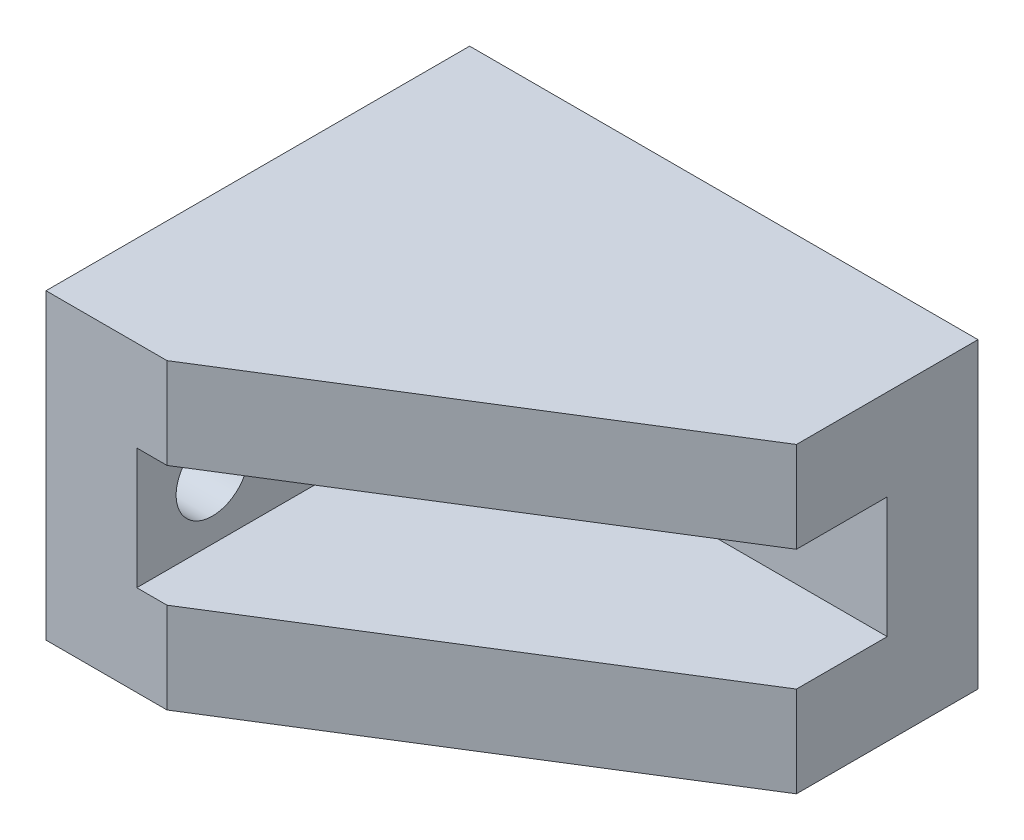
ISO-10303-21;
HEADER;
FILE_DESCRIPTION(('STEP AP214'),'2;1');
FILE_NAME('part.step','',(''),(''),'','','');
FILE_SCHEMA(('AUTOMOTIVE_DESIGN { 1 0 10303 214 1 1 1 1 }'));
ENDSEC;
DATA;
#1=APPLICATION_CONTEXT('core data for automotive mechanical design processes');
#2=APPLICATION_PROTOCOL_DEFINITION('international standard','automotive_design',2000,#1);
#3=PRODUCT_CONTEXT('',#1,'mechanical');
#4=PRODUCT('Part','Part','',(#3));
#5=PRODUCT_RELATED_PRODUCT_CATEGORY('part','',(#4));
#6=PRODUCT_DEFINITION_FORMATION('','',#4);
#7=PRODUCT_DEFINITION_CONTEXT('part definition',#1,'design');
#8=PRODUCT_DEFINITION('design','',#6,#7);
#9=PRODUCT_DEFINITION_SHAPE('','',#8);
#10=(LENGTH_UNIT() NAMED_UNIT(*) SI_UNIT(.MILLI.,.METRE.));
#11=(NAMED_UNIT(*) PLANE_ANGLE_UNIT() SI_UNIT($,.RADIAN.));
#12=(NAMED_UNIT(*) SI_UNIT($,.STERADIAN.) SOLID_ANGLE_UNIT());
#13=UNCERTAINTY_MEASURE_WITH_UNIT(LENGTH_MEASURE(1.E-05),#10,'distance_accuracy_value','');
#14=(GEOMETRIC_REPRESENTATION_CONTEXT(3) GLOBAL_UNCERTAINTY_ASSIGNED_CONTEXT((#13)) GLOBAL_UNIT_ASSIGNED_CONTEXT((#10,
#11,#12)) REPRESENTATION_CONTEXT('',''));
#15=CARTESIAN_POINT('',(0.,0.,0.));
#16=DIRECTION('',(0.,0.,1.));
#17=DIRECTION('',(1.,0.,0.));
#18=AXIS2_PLACEMENT_3D('',#15,#16,#17);
#19=CARTESIAN_POINT('',(0.,25.,35.));
#20=DIRECTION('',(0.,0.,-1.));
#21=DIRECTION('',(-1.,0.,0.));
#22=AXIS2_PLACEMENT_3D('',#19,#20,#21);
#23=PLANE('',#22);
#24=DIRECTION('',(1.,0.,0.));
#25=VECTOR('',#24,1.);
#26=CARTESIAN_POINT('',(0.,7.5,35.));
#27=LINE('',#26,#25);
#28=CARTESIAN_POINT('',(7.5,7.5,35.));
#29=VERTEX_POINT('',#28);
#30=CARTESIAN_POINT('',(10.,7.5,35.));
#31=VERTEX_POINT('',#30);
#32=EDGE_CURVE('E178',#29,#31,#27,.T.);
#33=ORIENTED_EDGE('',*,*,#32,.F.);
#34=DIRECTION('',(0.,-1.,0.));
#35=VECTOR('',#34,1.);
#36=CARTESIAN_POINT('',(7.5,25.,35.));
#37=LINE('',#36,#35);
#38=CARTESIAN_POINT('',(7.5,17.5,35.));
#39=VERTEX_POINT('',#38);
#40=EDGE_CURVE('E130',#39,#29,#37,.T.);
#41=ORIENTED_EDGE('',*,*,#40,.F.);
#42=DIRECTION('',(1.,0.,0.));
#43=VECTOR('',#42,1.);
#44=CARTESIAN_POINT('',(0.,17.5,35.));
#45=LINE('',#44,#43);
#46=CARTESIAN_POINT('',(10.,17.5,35.));
#47=VERTEX_POINT('',#46);
#48=EDGE_CURVE('E162',#39,#47,#45,.T.);
#49=ORIENTED_EDGE('',*,*,#48,.T.);
#50=DIRECTION('',(0.,-1.,0.));
#51=VECTOR('',#50,1.);
#52=CARTESIAN_POINT('',(10.,25.,35.));
#53=LINE('',#52,#51);
#54=CARTESIAN_POINT('',(10.,25.,35.));
#55=VERTEX_POINT('',#54);
#56=EDGE_CURVE('E42',#55,#47,#53,.T.);
#57=ORIENTED_EDGE('',*,*,#56,.F.);
#58=DIRECTION('',(1.,0.,0.));
#59=VECTOR('',#58,1.);
#60=CARTESIAN_POINT('',(0.,25.,35.));
#61=LINE('',#60,#59);
#62=CARTESIAN_POINT('',(0.,25.,35.));
#63=VERTEX_POINT('',#62);
#64=EDGE_CURVE('E90',#63,#55,#61,.T.);
#65=ORIENTED_EDGE('',*,*,#64,.F.);
#66=DIRECTION('',(0.,-1.,0.));
#67=VECTOR('',#66,1.);
#68=CARTESIAN_POINT('',(0.,25.,35.));
#69=LINE('',#68,#67);
#70=CARTESIAN_POINT('',(0.,0.,35.));
#71=VERTEX_POINT('',#70);
#72=EDGE_CURVE('E11',#63,#71,#69,.T.);
#73=ORIENTED_EDGE('',*,*,#72,.T.);
#74=DIRECTION('',(1.,0.,0.));
#75=VECTOR('',#74,1.);
#76=CARTESIAN_POINT('',(0.,0.,35.));
#77=LINE('',#76,#75);
#78=CARTESIAN_POINT('',(10.,0.,35.));
#79=VERTEX_POINT('',#78);
#80=EDGE_CURVE('E129',#71,#79,#77,.T.);
#81=ORIENTED_EDGE('',*,*,#80,.T.);
#82=EDGE_CURVE('E115',#31,#79,#53,.T.);
#83=ORIENTED_EDGE('',*,*,#82,.F.);
#84=EDGE_LOOP('',(#33,#41,#49,#57,#65,#73,#81,#83));
#85=FACE_BOUND('',#84,.T.);
#86=ADVANCED_FACE('F34',(#85),#23,.F.);
#87=CARTESIAN_POINT('',(10.,25.,35.));
#88=DIRECTION('',(-0.52999894000318,0.,-0.847998304005088));
#89=DIRECTION('',(-0.847998304005088,0.,0.52999894000318));
#90=AXIS2_PLACEMENT_3D('',#87,#88,#89);
#91=PLANE('',#90);
#92=DIRECTION('',(0.847998304005088,0.,-0.52999894000318));
#93=VECTOR('',#92,1.);
#94=CARTESIAN_POINT('',(10.,7.5,35.));
#95=LINE('',#94,#93);
#96=CARTESIAN_POINT('',(42.,7.5,15.));
#97=VERTEX_POINT('',#96);
#98=EDGE_CURVE('E151',#31,#97,#95,.T.);
#99=ORIENTED_EDGE('',*,*,#98,.F.);
#100=ORIENTED_EDGE('',*,*,#82,.T.);
#101=DIRECTION('',(0.847998304005088,0.,-0.52999894000318));
#102=VECTOR('',#101,1.);
#103=CARTESIAN_POINT('',(10.,0.,35.));
#104=LINE('',#103,#102);
#105=CARTESIAN_POINT('',(42.,0.,15.));
#106=VERTEX_POINT('',#105);
#107=EDGE_CURVE('E133',#79,#106,#104,.T.);
#108=ORIENTED_EDGE('',*,*,#107,.T.);
#109=DIRECTION('',(0.,-1.,0.));
#110=VECTOR('',#109,1.);
#111=CARTESIAN_POINT('',(42.,25.,15.));
#112=LINE('',#111,#110);
#113=EDGE_CURVE('E116',#97,#106,#112,.T.);
#114=ORIENTED_EDGE('',*,*,#113,.F.);
#115=EDGE_LOOP('',(#99,#100,#108,#114));
#116=FACE_BOUND('',#115,.T.);
#117=ADVANCED_FACE('F145',(#116),#91,.F.);
#118=CARTESIAN_POINT('',(42.,25.,0.));
#119=DIRECTION('',(-1.,0.,0.));
#120=DIRECTION('',(0.,0.,1.));
#121=AXIS2_PLACEMENT_3D('',#118,#119,#120);
#122=PLANE('',#121);
#123=DIRECTION('',(0.,0.,-1.));
#124=VECTOR('',#123,1.);
#125=CARTESIAN_POINT('',(42.,7.5,0.));
#126=LINE('',#125,#124);
#127=CARTESIAN_POINT('',(42.,7.5,7.5));
#128=VERTEX_POINT('',#127);
#129=EDGE_CURVE('E173',#97,#128,#126,.T.);
#130=ORIENTED_EDGE('',*,*,#129,.F.);
#131=ORIENTED_EDGE('',*,*,#113,.T.);
#132=DIRECTION('',(0.,0.,-1.));
#133=VECTOR('',#132,1.);
#134=CARTESIAN_POINT('',(42.,0.,0.));
#135=LINE('',#134,#133);
#136=CARTESIAN_POINT('',(42.,0.,0.));
#137=VERTEX_POINT('',#136);
#138=EDGE_CURVE('E136',#106,#137,#135,.T.);
#139=ORIENTED_EDGE('',*,*,#138,.T.);
#140=DIRECTION('',(0.,-1.,0.));
#141=VECTOR('',#140,1.);
#142=CARTESIAN_POINT('',(42.,25.,0.));
#143=LINE('',#142,#141);
#144=CARTESIAN_POINT('',(42.,25.,0.));
#145=VERTEX_POINT('',#144);
#146=EDGE_CURVE('E120',#145,#137,#143,.T.);
#147=ORIENTED_EDGE('',*,*,#146,.F.);
#148=DIRECTION('',(0.,0.,-1.));
#149=VECTOR('',#148,1.);
#150=CARTESIAN_POINT('',(42.,25.,0.));
#151=LINE('',#150,#149);
#152=CARTESIAN_POINT('',(42.,25.,15.));
#153=VERTEX_POINT('',#152);
#154=EDGE_CURVE('E101',#153,#145,#151,.T.);
#155=ORIENTED_EDGE('',*,*,#154,.F.);
#156=CARTESIAN_POINT('',(42.,17.5,15.));
#157=VERTEX_POINT('',#156);
#158=EDGE_CURVE('E108',#153,#157,#112,.T.);
#159=ORIENTED_EDGE('',*,*,#158,.T.);
#160=DIRECTION('',(0.,0.,-1.));
#161=VECTOR('',#160,1.);
#162=CARTESIAN_POINT('',(42.,17.5,0.));
#163=LINE('',#162,#161);
#164=CARTESIAN_POINT('',(42.,17.5,7.5));
#165=VERTEX_POINT('',#164);
#166=EDGE_CURVE('E167',#157,#165,#163,.T.);
#167=ORIENTED_EDGE('',*,*,#166,.T.);
#168=DIRECTION('',(0.,-1.,0.));
#169=VECTOR('',#168,1.);
#170=CARTESIAN_POINT('',(42.,25.,7.5));
#171=LINE('',#170,#169);
#172=EDGE_CURVE('E169',#165,#128,#171,.T.);
#173=ORIENTED_EDGE('',*,*,#172,.T.);
#174=EDGE_LOOP('',(#130,#131,#139,#147,#155,#159,#167,#173));
#175=FACE_BOUND('',#174,.T.);
#176=ADVANCED_FACE('F119',(#175),#122,.F.);
#177=CARTESIAN_POINT('',(0.,25.,0.));
#178=DIRECTION('',(1.,0.,0.));
#179=DIRECTION('',(0.,0.,-1.));
#180=AXIS2_PLACEMENT_3D('',#177,#178,#179);
#181=PLANE('',#180);
#182=CARTESIAN_POINT('',(0.,12.5,28.75));
#183=DIRECTION('',(1.,0.,0.));
#184=DIRECTION('',(0.,0.,-1.));
#185=AXIS2_PLACEMENT_3D('',#182,#183,#184);
#186=CIRCLE('',#185,3.);
#187=CARTESIAN_POINT('',(0.,12.5,25.75));
#188=VERTEX_POINT('',#187);
#189=EDGE_CURVE('E193',#188,#188,#186,.T.);
#190=ORIENTED_EDGE('',*,*,#189,.T.);
#191=EDGE_LOOP('',(#190));
#192=FACE_BOUND('',#191,.T.);
#193=CARTESIAN_POINT('',(0.,12.5,13.75));
#194=DIRECTION('',(1.,0.,0.));
#195=DIRECTION('',(0.,0.,-1.));
#196=AXIS2_PLACEMENT_3D('',#193,#194,#195);
#197=CIRCLE('',#196,3.);
#198=CARTESIAN_POINT('',(0.,12.5,10.75));
#199=VERTEX_POINT('',#198);
#200=EDGE_CURVE('E196',#199,#199,#197,.T.);
#201=ORIENTED_EDGE('',*,*,#200,.T.);
#202=EDGE_LOOP('',(#201));
#203=FACE_BOUND('',#202,.T.);
#204=DIRECTION('',(0.,0.,1.));
#205=VECTOR('',#204,1.);
#206=CARTESIAN_POINT('',(0.,0.,0.));
#207=LINE('',#206,#205);
#208=CARTESIAN_POINT('',(0.,0.,0.));
#209=VERTEX_POINT('',#208);
#210=EDGE_CURVE('E126',#209,#71,#207,.T.);
#211=ORIENTED_EDGE('',*,*,#210,.T.);
#212=ORIENTED_EDGE('',*,*,#72,.F.);
#213=DIRECTION('',(0.,0.,1.));
#214=VECTOR('',#213,1.);
#215=CARTESIAN_POINT('',(0.,25.,0.));
#216=LINE('',#215,#214);
#217=CARTESIAN_POINT('',(0.,25.,0.));
#218=VERTEX_POINT('',#217);
#219=EDGE_CURVE('E139',#218,#63,#216,.T.);
#220=ORIENTED_EDGE('',*,*,#219,.F.);
#221=DIRECTION('',(0.,-1.,0.));
#222=VECTOR('',#221,1.);
#223=CARTESIAN_POINT('',(0.,25.,0.));
#224=LINE('',#223,#222);
#225=EDGE_CURVE('E122',#218,#209,#224,.T.);
#226=ORIENTED_EDGE('',*,*,#225,.T.);
#227=EDGE_LOOP('',(#211,#212,#220,#226));
#228=FACE_BOUND('',#227,.T.);
#229=ADVANCED_FACE('F36',(#192,#203,#228),#181,.F.);
#230=ORIENTED_EDGE('',*,*,#56,.T.);
#231=DIRECTION('',(0.847998304005088,0.,-0.52999894000318));
#232=VECTOR('',#231,1.);
#233=CARTESIAN_POINT('',(10.,17.5,35.));
#234=LINE('',#233,#232);
#235=EDGE_CURVE('E112',#47,#157,#234,.T.);
#236=ORIENTED_EDGE('',*,*,#235,.T.);
#237=ORIENTED_EDGE('',*,*,#158,.F.);
#238=DIRECTION('',(0.847998304005088,0.,-0.52999894000318));
#239=VECTOR('',#238,1.);
#240=CARTESIAN_POINT('',(10.,25.,35.));
#241=LINE('',#240,#239);
#242=EDGE_CURVE('E97',#55,#153,#241,.T.);
#243=ORIENTED_EDGE('',*,*,#242,.F.);
#244=EDGE_LOOP('',(#230,#236,#237,#243));
#245=FACE_BOUND('',#244,.T.);
#246=ADVANCED_FACE('F109',(#245),#91,.F.);
#247=CARTESIAN_POINT('',(0.,25.,0.));
#248=DIRECTION('',(0.,0.,1.));
#249=DIRECTION('',(1.,0.,0.));
#250=AXIS2_PLACEMENT_3D('',#247,#248,#249);
#251=PLANE('',#250);
#252=CARTESIAN_POINT('',(17.25,12.5,0.));
#253=DIRECTION('',(0.,0.,1.));
#254=DIRECTION('',(1.,0.,0.));
#255=AXIS2_PLACEMENT_3D('',#252,#253,#254);
#256=CIRCLE('',#255,2.5);
#257=CARTESIAN_POINT('',(19.75,12.5,0.));
#258=VERTEX_POINT('',#257);
#259=EDGE_CURVE('E203',#258,#258,#256,.T.);
#260=ORIENTED_EDGE('',*,*,#259,.T.);
#261=EDGE_LOOP('',(#260));
#262=FACE_BOUND('',#261,.T.);
#263=CARTESIAN_POINT('',(32.25,12.5,0.));
#264=DIRECTION('',(0.,0.,1.));
#265=DIRECTION('',(1.,0.,0.));
#266=AXIS2_PLACEMENT_3D('',#263,#264,#265);
#267=CIRCLE('',#266,2.5);
#268=CARTESIAN_POINT('',(34.75,12.5,0.));
#269=VERTEX_POINT('',#268);
#270=EDGE_CURVE('E208',#269,#269,#267,.T.);
#271=ORIENTED_EDGE('',*,*,#270,.T.);
#272=EDGE_LOOP('',(#271));
#273=FACE_BOUND('',#272,.T.);
#274=DIRECTION('',(-1.,0.,0.));
#275=VECTOR('',#274,1.);
#276=CARTESIAN_POINT('',(0.,0.,0.));
#277=LINE('',#276,#275);
#278=EDGE_CURVE('E82',#137,#209,#277,.T.);
#279=ORIENTED_EDGE('',*,*,#278,.T.);
#280=ORIENTED_EDGE('',*,*,#225,.F.);
#281=DIRECTION('',(-1.,0.,0.));
#282=VECTOR('',#281,1.);
#283=CARTESIAN_POINT('',(0.,25.,0.));
#284=LINE('',#283,#282);
#285=EDGE_CURVE('E58',#145,#218,#284,.T.);
#286=ORIENTED_EDGE('',*,*,#285,.F.);
#287=ORIENTED_EDGE('',*,*,#146,.T.);
#288=EDGE_LOOP('',(#279,#280,#286,#287));
#289=FACE_BOUND('',#288,.T.);
#290=ADVANCED_FACE('F157',(#262,#273,#289),#251,.F.);
#291=CARTESIAN_POINT('',(0.,25.,0.));
#292=DIRECTION('',(0.,1.,0.));
#293=DIRECTION('',(0.,0.,1.));
#294=AXIS2_PLACEMENT_3D('',#291,#292,#293);
#295=PLANE('',#294);
#296=ORIENTED_EDGE('',*,*,#219,.T.);
#297=ORIENTED_EDGE('',*,*,#64,.T.);
#298=ORIENTED_EDGE('',*,*,#242,.T.);
#299=ORIENTED_EDGE('',*,*,#154,.T.);
#300=ORIENTED_EDGE('',*,*,#285,.T.);
#301=EDGE_LOOP('',(#296,#297,#298,#299,#300));
#302=FACE_BOUND('',#301,.T.);
#303=ADVANCED_FACE('F99',(#302),#295,.T.);
#304=CARTESIAN_POINT('',(0.,0.,0.));
#305=DIRECTION('',(0.,1.,0.));
#306=DIRECTION('',(0.,0.,1.));
#307=AXIS2_PLACEMENT_3D('',#304,#305,#306);
#308=PLANE('',#307);
#309=ORIENTED_EDGE('',*,*,#210,.F.);
#310=ORIENTED_EDGE('',*,*,#278,.F.);
#311=ORIENTED_EDGE('',*,*,#138,.F.);
#312=ORIENTED_EDGE('',*,*,#107,.F.);
#313=ORIENTED_EDGE('',*,*,#80,.F.);
#314=EDGE_LOOP('',(#309,#310,#311,#312,#313));
#315=FACE_BOUND('',#314,.T.);
#316=ADVANCED_FACE('F156',(#315),#308,.F.);
#317=CARTESIAN_POINT('',(7.5,25.,0.));
#318=DIRECTION('',(1.,0.,0.));
#319=DIRECTION('',(0.,0.,-1.));
#320=AXIS2_PLACEMENT_3D('',#317,#318,#319);
#321=PLANE('',#320);
#322=CARTESIAN_POINT('',(7.5,12.5,28.75));
#323=DIRECTION('',(1.,0.,0.));
#324=DIRECTION('',(0.,0.,-1.));
#325=AXIS2_PLACEMENT_3D('',#322,#323,#324);
#326=CIRCLE('',#325,3.);
#327=CARTESIAN_POINT('',(7.5,12.5,25.75));
#328=VERTEX_POINT('',#327);
#329=EDGE_CURVE('E199',#328,#328,#326,.T.);
#330=ORIENTED_EDGE('',*,*,#329,.F.);
#331=EDGE_LOOP('',(#330));
#332=FACE_BOUND('',#331,.T.);
#333=CARTESIAN_POINT('',(7.5,12.5,13.75));
#334=DIRECTION('',(1.,0.,0.));
#335=DIRECTION('',(0.,0.,-1.));
#336=AXIS2_PLACEMENT_3D('',#333,#334,#335);
#337=CIRCLE('',#336,3.);
#338=CARTESIAN_POINT('',(7.5,12.5,10.75));
#339=VERTEX_POINT('',#338);
#340=EDGE_CURVE('E200',#339,#339,#337,.T.);
#341=ORIENTED_EDGE('',*,*,#340,.F.);
#342=EDGE_LOOP('',(#341));
#343=FACE_BOUND('',#342,.T.);
#344=DIRECTION('',(0.,0.,1.));
#345=VECTOR('',#344,1.);
#346=CARTESIAN_POINT('',(7.5,7.5,0.));
#347=LINE('',#346,#345);
#348=CARTESIAN_POINT('',(7.5,7.5,7.5));
#349=VERTEX_POINT('',#348);
#350=EDGE_CURVE('E181',#349,#29,#347,.T.);
#351=ORIENTED_EDGE('',*,*,#350,.F.);
#352=DIRECTION('',(0.,-1.,0.));
#353=VECTOR('',#352,1.);
#354=CARTESIAN_POINT('',(7.5,25.,7.5));
#355=LINE('',#354,#353);
#356=CARTESIAN_POINT('',(7.5,17.5,7.5));
#357=VERTEX_POINT('',#356);
#358=EDGE_CURVE('E172',#357,#349,#355,.T.);
#359=ORIENTED_EDGE('',*,*,#358,.F.);
#360=DIRECTION('',(0.,0.,1.));
#361=VECTOR('',#360,1.);
#362=CARTESIAN_POINT('',(7.5,17.5,0.));
#363=LINE('',#362,#361);
#364=EDGE_CURVE('E165',#357,#39,#363,.T.);
#365=ORIENTED_EDGE('',*,*,#364,.T.);
#366=ORIENTED_EDGE('',*,*,#40,.T.);
#367=EDGE_LOOP('',(#351,#359,#365,#366));
#368=FACE_BOUND('',#367,.T.);
#369=ADVANCED_FACE('F225',(#332,#343,#368),#321,.T.);
#370=CARTESIAN_POINT('',(0.,25.,7.5));
#371=DIRECTION('',(0.,0.,1.));
#372=DIRECTION('',(1.,0.,0.));
#373=AXIS2_PLACEMENT_3D('',#370,#371,#372);
#374=PLANE('',#373);
#375=CARTESIAN_POINT('',(17.25,12.5,7.5));
#376=DIRECTION('',(0.,0.,1.));
#377=DIRECTION('',(1.,0.,0.));
#378=AXIS2_PLACEMENT_3D('',#375,#376,#377);
#379=CIRCLE('',#378,2.5);
#380=CARTESIAN_POINT('',(19.75,12.5,7.5));
#381=VERTEX_POINT('',#380);
#382=EDGE_CURVE('E211',#381,#381,#379,.T.);
#383=ORIENTED_EDGE('',*,*,#382,.F.);
#384=EDGE_LOOP('',(#383));
#385=FACE_BOUND('',#384,.T.);
#386=CARTESIAN_POINT('',(32.25,12.5,7.5));
#387=DIRECTION('',(0.,0.,1.));
#388=DIRECTION('',(-1.,0.,0.));
#389=AXIS2_PLACEMENT_3D('',#386,#387,#388);
#390=CIRCLE('',#389,2.5);
#391=CARTESIAN_POINT('',(29.75,12.5,7.5));
#392=VERTEX_POINT('',#391);
#393=EDGE_CURVE('E212',#392,#392,#390,.T.);
#394=ORIENTED_EDGE('',*,*,#393,.F.);
#395=EDGE_LOOP('',(#394));
#396=FACE_BOUND('',#395,.T.);
#397=DIRECTION('',(-1.,0.,0.));
#398=VECTOR('',#397,1.);
#399=CARTESIAN_POINT('',(0.,7.5,7.5));
#400=LINE('',#399,#398);
#401=EDGE_CURVE('E176',#128,#349,#400,.T.);
#402=ORIENTED_EDGE('',*,*,#401,.F.);
#403=ORIENTED_EDGE('',*,*,#172,.F.);
#404=DIRECTION('',(-1.,0.,0.));
#405=VECTOR('',#404,1.);
#406=CARTESIAN_POINT('',(0.,17.5,7.5));
#407=LINE('',#406,#405);
#408=EDGE_CURVE('E49',#165,#357,#407,.T.);
#409=ORIENTED_EDGE('',*,*,#408,.T.);
#410=ORIENTED_EDGE('',*,*,#358,.T.);
#411=EDGE_LOOP('',(#402,#403,#409,#410));
#412=FACE_BOUND('',#411,.T.);
#413=ADVANCED_FACE('F221',(#385,#396,#412),#374,.T.);
#414=CARTESIAN_POINT('',(0.,17.5,0.));
#415=DIRECTION('',(0.,1.,0.));
#416=DIRECTION('',(0.,0.,1.));
#417=AXIS2_PLACEMENT_3D('',#414,#415,#416);
#418=PLANE('',#417);
#419=ORIENTED_EDGE('',*,*,#364,.F.);
#420=ORIENTED_EDGE('',*,*,#408,.F.);
#421=ORIENTED_EDGE('',*,*,#166,.F.);
#422=ORIENTED_EDGE('',*,*,#235,.F.);
#423=ORIENTED_EDGE('',*,*,#48,.F.);
#424=EDGE_LOOP('',(#419,#420,#421,#422,#423));
#425=FACE_BOUND('',#424,.T.);
#426=ADVANCED_FACE('F224',(#425),#418,.F.);
#427=CARTESIAN_POINT('',(0.,7.5,0.));
#428=DIRECTION('',(0.,1.,0.));
#429=DIRECTION('',(0.,0.,1.));
#430=AXIS2_PLACEMENT_3D('',#427,#428,#429);
#431=PLANE('',#430);
#432=ORIENTED_EDGE('',*,*,#350,.T.);
#433=ORIENTED_EDGE('',*,*,#32,.T.);
#434=ORIENTED_EDGE('',*,*,#98,.T.);
#435=ORIENTED_EDGE('',*,*,#129,.T.);
#436=ORIENTED_EDGE('',*,*,#401,.T.);
#437=EDGE_LOOP('',(#432,#433,#434,#435,#436));
#438=FACE_BOUND('',#437,.T.);
#439=ADVANCED_FACE('F247',(#438),#431,.T.);
#440=CARTESIAN_POINT('',(-22.5,12.5,13.75));
#441=DIRECTION('',(1.,0.,0.));
#442=DIRECTION('',(0.,0.,-1.));
#443=AXIS2_PLACEMENT_3D('',#440,#441,#442);
#444=CYLINDRICAL_SURFACE('',#443,3.);
#445=ORIENTED_EDGE('',*,*,#340,.T.);
#446=EDGE_LOOP('',(#445));
#447=FACE_BOUND('',#446,.T.);
#448=ORIENTED_EDGE('',*,*,#200,.F.);
#449=EDGE_LOOP('',(#448));
#450=FACE_BOUND('',#449,.T.);
#451=ADVANCED_FACE('F249',(#447,#450),#444,.F.);
#452=CARTESIAN_POINT('',(-22.5,12.5,28.75));
#453=DIRECTION('',(1.,0.,0.));
#454=DIRECTION('',(0.,0.,-1.));
#455=AXIS2_PLACEMENT_3D('',#452,#453,#454);
#456=CYLINDRICAL_SURFACE('',#455,3.);
#457=ORIENTED_EDGE('',*,*,#329,.T.);
#458=EDGE_LOOP('',(#457));
#459=FACE_BOUND('',#458,.T.);
#460=ORIENTED_EDGE('',*,*,#189,.F.);
#461=EDGE_LOOP('',(#460));
#462=FACE_BOUND('',#461,.T.);
#463=ADVANCED_FACE('F255',(#459,#462),#456,.F.);
#464=CARTESIAN_POINT('',(32.25,12.5,-2.5));
#465=DIRECTION('',(0.,0.,1.));
#466=DIRECTION('',(1.,0.,0.));
#467=AXIS2_PLACEMENT_3D('',#464,#465,#466);
#468=CYLINDRICAL_SURFACE('',#467,2.5);
#469=ORIENTED_EDGE('',*,*,#393,.T.);
#470=EDGE_LOOP('',(#469));
#471=FACE_BOUND('',#470,.T.);
#472=ORIENTED_EDGE('',*,*,#270,.F.);
#473=EDGE_LOOP('',(#472));
#474=FACE_BOUND('',#473,.T.);
#475=ADVANCED_FACE('F358',(#471,#474),#468,.F.);
#476=CARTESIAN_POINT('',(17.25,12.5,-2.5));
#477=DIRECTION('',(0.,0.,1.));
#478=DIRECTION('',(1.,0.,0.));
#479=AXIS2_PLACEMENT_3D('',#476,#477,#478);
#480=CYLINDRICAL_SURFACE('',#479,2.5);
#481=ORIENTED_EDGE('',*,*,#382,.T.);
#482=EDGE_LOOP('',(#481));
#483=FACE_BOUND('',#482,.T.);
#484=ORIENTED_EDGE('',*,*,#259,.F.);
#485=EDGE_LOOP('',(#484));
#486=FACE_BOUND('',#485,.T.);
#487=ADVANCED_FACE('F218',(#483,#486),#480,.F.);
#488=CLOSED_SHELL('',(#86,#117,#176,#229,#246,#290,#303,#316,#369,#413,#426,#439,#451,#463,#475,#487));
#489=MANIFOLD_SOLID_BREP('B2',#488);
#490=ADVANCED_BREP_SHAPE_REPRESENTATION('',(#18,#489),#14);
#491=SHAPE_DEFINITION_REPRESENTATION(#9,#490);
ENDSEC;
END-ISO-10303-21;
